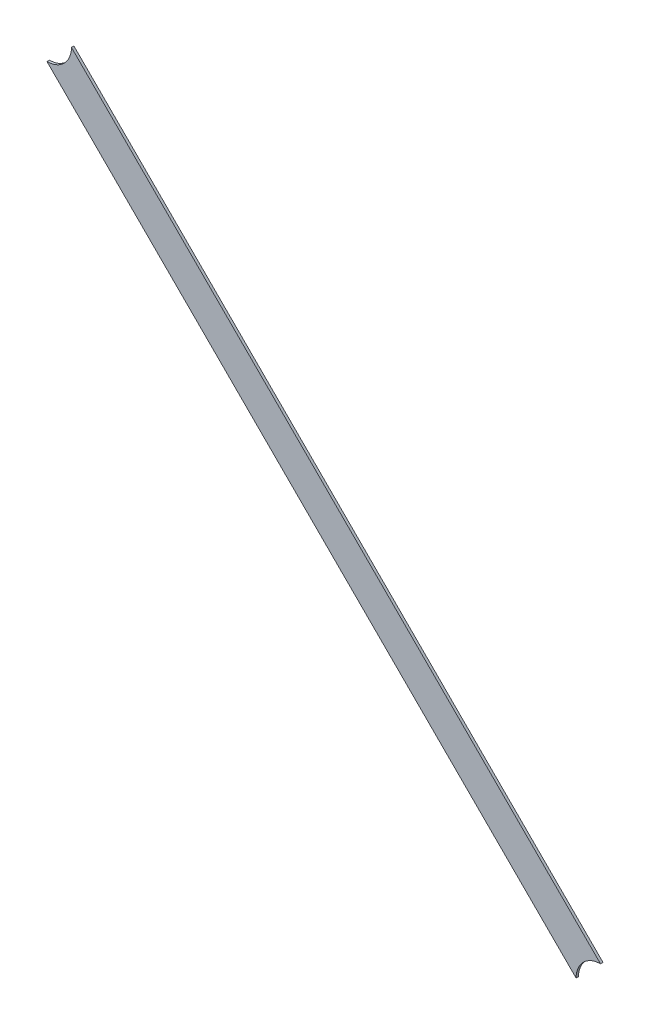
ISO-10303-21;
HEADER;
FILE_DESCRIPTION(('STEP AP214'),'2;1');
FILE_NAME('part.step','',(''),(''),'','','');
FILE_SCHEMA(('AUTOMOTIVE_DESIGN { 1 0 10303 214 1 1 1 1 }'));
ENDSEC;
DATA;
#1=APPLICATION_CONTEXT('core data for automotive mechanical design processes');
#2=APPLICATION_PROTOCOL_DEFINITION('international standard','automotive_design',2000,#1);
#3=PRODUCT_CONTEXT('',#1,'mechanical');
#4=PRODUCT('Part','Part','',(#3));
#5=PRODUCT_RELATED_PRODUCT_CATEGORY('part','',(#4));
#6=PRODUCT_DEFINITION_FORMATION('','',#4);
#7=PRODUCT_DEFINITION_CONTEXT('part definition',#1,'design');
#8=PRODUCT_DEFINITION('design','',#6,#7);
#9=PRODUCT_DEFINITION_SHAPE('','',#8);
#10=(LENGTH_UNIT() NAMED_UNIT(*) SI_UNIT(.MILLI.,.METRE.));
#11=(NAMED_UNIT(*) PLANE_ANGLE_UNIT() SI_UNIT($,.RADIAN.));
#12=(NAMED_UNIT(*) SI_UNIT($,.STERADIAN.) SOLID_ANGLE_UNIT());
#13=UNCERTAINTY_MEASURE_WITH_UNIT(LENGTH_MEASURE(1.E-05),#10,'distance_accuracy_value','');
#14=(GEOMETRIC_REPRESENTATION_CONTEXT(3) GLOBAL_UNCERTAINTY_ASSIGNED_CONTEXT((#13)) GLOBAL_UNIT_ASSIGNED_CONTEXT((#10,
#11,#12)) REPRESENTATION_CONTEXT('',''));
#15=CARTESIAN_POINT('',(0.,0.,0.));
#16=DIRECTION('',(0.,0.,1.));
#17=DIRECTION('',(1.,0.,0.));
#18=AXIS2_PLACEMENT_3D('',#15,#16,#17);
#19=CARTESIAN_POINT('',(98.9020417005108,92.6444052794892,0.));
#20=DIRECTION('',(0.707106781186548,0.707106781186548,0.));
#21=DIRECTION('',(0.707106781186548,-0.707106781186548,0.));
#22=AXIS2_PLACEMENT_3D('',#19,#20,#21);
#23=PLANE('',#22);
#24=DIRECTION('',(0.707106781186548,-0.707106781186548,0.));
#25=VECTOR('',#24,1.);
#26=CARTESIAN_POINT('',(98.72322394,92.82322304,0.03556));
#27=LINE('',#26,#25);
#28=CARTESIAN_POINT('',(98.9020417005108,92.6444052794892,0.03556));
#29=VERTEX_POINT('',#28);
#30=CARTESIAN_POINT('',(106.544405419489,85.0020415605108,0.03556));
#31=VERTEX_POINT('',#30);
#32=EDGE_CURVE('E11',#29,#31,#27,.T.);
#33=ORIENTED_EDGE('',*,*,#32,.F.);
#34=DIRECTION('',(0.,0.,1.));
#35=VECTOR('',#34,1.);
#36=CARTESIAN_POINT('',(98.9020417005108,92.6444052794892,0.));
#37=LINE('',#36,#35);
#38=CARTESIAN_POINT('',(98.9020417005108,92.6444052794892,0.));
#39=VERTEX_POINT('',#38);
#40=EDGE_CURVE('E24',#39,#29,#37,.T.);
#41=ORIENTED_EDGE('',*,*,#40,.F.);
#42=DIRECTION('',(0.707106781186548,-0.707106781186548,0.));
#43=VECTOR('',#42,1.);
#44=CARTESIAN_POINT('',(98.72322394,92.82322304,0.));
#45=LINE('',#44,#43);
#46=CARTESIAN_POINT('',(106.544405419489,85.0020415605108,0.));
#47=VERTEX_POINT('',#46);
#48=EDGE_CURVE('E75',#39,#47,#45,.T.);
#49=ORIENTED_EDGE('',*,*,#48,.T.);
#50=DIRECTION('',(0.,0.,1.));
#51=VECTOR('',#50,1.);
#52=CARTESIAN_POINT('',(106.544405419489,85.0020415605108,0.));
#53=LINE('',#52,#51);
#54=EDGE_CURVE('E37',#47,#31,#53,.T.);
#55=ORIENTED_EDGE('',*,*,#54,.T.);
#56=EDGE_LOOP('',(#33,#41,#49,#55));
#57=FACE_BOUND('',#56,.T.);
#58=ADVANCED_FACE('F17',(#57),#23,.F.);
#59=CARTESIAN_POINT('',(106.89999956,85.00000018,0.));
#60=DIRECTION('',(0.,0.,-1.));
#61=DIRECTION('',(1.,0.,0.));
#62=AXIS2_PLACEMENT_3D('',#59,#60,#61);
#63=CYLINDRICAL_SURFACE('',#62,0.3556);
#64=DIRECTION('',(0.,0.,1.));
#65=VECTOR('',#64,1.);
#66=CARTESIAN_POINT('',(106.897958179489,85.3555943205108,0.));
#67=LINE('',#66,#65);
#68=CARTESIAN_POINT('',(106.897958179489,85.3555943205108,0.));
#69=VERTEX_POINT('',#68);
#70=CARTESIAN_POINT('',(106.897958179489,85.3555943205108,0.03556));
#71=VERTEX_POINT('',#70);
#72=EDGE_CURVE('E67',#69,#71,#67,.T.);
#73=ORIENTED_EDGE('',*,*,#72,.T.);
#74=CARTESIAN_POINT('',(106.89999956,85.00000018,0.03556));
#75=DIRECTION('',(0.,0.,1.));
#76=DIRECTION('',(1.,0.,0.));
#77=AXIS2_PLACEMENT_3D('',#74,#75,#76);
#78=CIRCLE('',#77,0.3556);
#79=EDGE_CURVE('E82',#71,#31,#78,.T.);
#80=ORIENTED_EDGE('',*,*,#79,.T.);
#81=ORIENTED_EDGE('',*,*,#54,.F.);
#82=CARTESIAN_POINT('',(106.89999956,85.00000018,0.));
#83=DIRECTION('',(0.,0.,1.));
#84=DIRECTION('',(1.,0.,0.));
#85=AXIS2_PLACEMENT_3D('',#82,#83,#84);
#86=CIRCLE('',#85,0.3556);
#87=EDGE_CURVE('E80',#69,#47,#86,.T.);
#88=ORIENTED_EDGE('',*,*,#87,.F.);
#89=EDGE_LOOP('',(#73,#80,#81,#88));
#90=FACE_BOUND('',#89,.T.);
#91=ADVANCED_FACE('F88',(#90),#63,.F.);
#92=CARTESIAN_POINT('',(106.897958179489,85.3555943205108,0.));
#93=DIRECTION('',(-0.707106781186548,-0.707106781186548,0.));
#94=DIRECTION('',(-0.707106781186548,0.707106781186548,0.));
#95=AXIS2_PLACEMENT_3D('',#92,#93,#94);
#96=PLANE('',#95);
#97=DIRECTION('',(-0.707106781186548,0.707106781186548,0.));
#98=VECTOR('',#97,1.);
#99=CARTESIAN_POINT('',(107.07677594,85.17677656,0.03556));
#100=LINE('',#99,#98);
#101=CARTESIAN_POINT('',(99.2555944605108,92.9979580394892,0.03556));
#102=VERTEX_POINT('',#101);
#103=EDGE_CURVE('E71',#71,#102,#100,.T.);
#104=ORIENTED_EDGE('',*,*,#103,.F.);
#105=ORIENTED_EDGE('',*,*,#72,.F.);
#106=DIRECTION('',(-0.707106781186548,0.707106781186548,0.));
#107=VECTOR('',#106,1.);
#108=CARTESIAN_POINT('',(107.07677594,85.17677656,0.));
#109=LINE('',#108,#107);
#110=CARTESIAN_POINT('',(99.2555944605108,92.9979580394892,0.));
#111=VERTEX_POINT('',#110);
#112=EDGE_CURVE('E63',#69,#111,#109,.T.);
#113=ORIENTED_EDGE('',*,*,#112,.T.);
#114=DIRECTION('',(0.,0.,1.));
#115=VECTOR('',#114,1.);
#116=CARTESIAN_POINT('',(99.2555944605108,92.9979580394892,0.));
#117=LINE('',#116,#115);
#118=EDGE_CURVE('E53',#111,#102,#117,.T.);
#119=ORIENTED_EDGE('',*,*,#118,.T.);
#120=EDGE_LOOP('',(#104,#105,#113,#119));
#121=FACE_BOUND('',#120,.T.);
#122=ADVANCED_FACE('F66',(#121),#96,.F.);
#123=CARTESIAN_POINT('',(98.90000032,92.99999942,0.));
#124=DIRECTION('',(0.,0.,-1.));
#125=DIRECTION('',(1.,0.,0.));
#126=AXIS2_PLACEMENT_3D('',#123,#124,#125);
#127=CYLINDRICAL_SURFACE('',#126,0.3556);
#128=ORIENTED_EDGE('',*,*,#40,.T.);
#129=CARTESIAN_POINT('',(98.90000032,92.99999942,0.03556));
#130=DIRECTION('',(0.,0.,1.));
#131=DIRECTION('',(1.,0.,0.));
#132=AXIS2_PLACEMENT_3D('',#129,#130,#131);
#133=CIRCLE('',#132,0.3556);
#134=EDGE_CURVE('E59',#29,#102,#133,.T.);
#135=ORIENTED_EDGE('',*,*,#134,.T.);
#136=ORIENTED_EDGE('',*,*,#118,.F.);
#137=CARTESIAN_POINT('',(98.90000032,92.99999942,0.));
#138=DIRECTION('',(0.,0.,1.));
#139=DIRECTION('',(1.,0.,0.));
#140=AXIS2_PLACEMENT_3D('',#137,#138,#139);
#141=CIRCLE('',#140,0.3556);
#142=EDGE_CURVE('E57',#39,#111,#141,.T.);
#143=ORIENTED_EDGE('',*,*,#142,.F.);
#144=EDGE_LOOP('',(#128,#135,#136,#143));
#145=FACE_BOUND('',#144,.T.);
#146=ADVANCED_FACE('F55',(#145),#127,.F.);
#147=CARTESIAN_POINT('',(98.72322394,92.82322304,0.));
#148=DIRECTION('',(0.,0.,-1.));
#149=DIRECTION('',(-1.,0.,0.));
#150=AXIS2_PLACEMENT_3D('',#147,#148,#149);
#151=PLANE('',#150);
#152=ORIENTED_EDGE('',*,*,#48,.F.);
#153=ORIENTED_EDGE('',*,*,#142,.T.);
#154=ORIENTED_EDGE('',*,*,#112,.F.);
#155=ORIENTED_EDGE('',*,*,#87,.T.);
#156=EDGE_LOOP('',(#152,#153,#154,#155));
#157=FACE_BOUND('',#156,.T.);
#158=ADVANCED_FACE('F74',(#157),#151,.T.);
#159=CARTESIAN_POINT('',(98.72322394,92.82322304,0.03556));
#160=DIRECTION('',(0.,0.,-1.));
#161=DIRECTION('',(-1.,0.,0.));
#162=AXIS2_PLACEMENT_3D('',#159,#160,#161);
#163=PLANE('',#162);
#164=ORIENTED_EDGE('',*,*,#134,.F.);
#165=ORIENTED_EDGE('',*,*,#32,.T.);
#166=ORIENTED_EDGE('',*,*,#79,.F.);
#167=ORIENTED_EDGE('',*,*,#103,.T.);
#168=EDGE_LOOP('',(#164,#165,#166,#167));
#169=FACE_BOUND('',#168,.T.);
#170=ADVANCED_FACE('F91',(#169),#163,.F.);
#171=CLOSED_SHELL('',(#58,#91,#122,#146,#158,#170));
#172=MANIFOLD_SOLID_BREP('B1',#171);
#173=ADVANCED_BREP_SHAPE_REPRESENTATION('',(#18,#172),#14);
#174=SHAPE_DEFINITION_REPRESENTATION(#9,#173);
ENDSEC;
END-ISO-10303-21;
